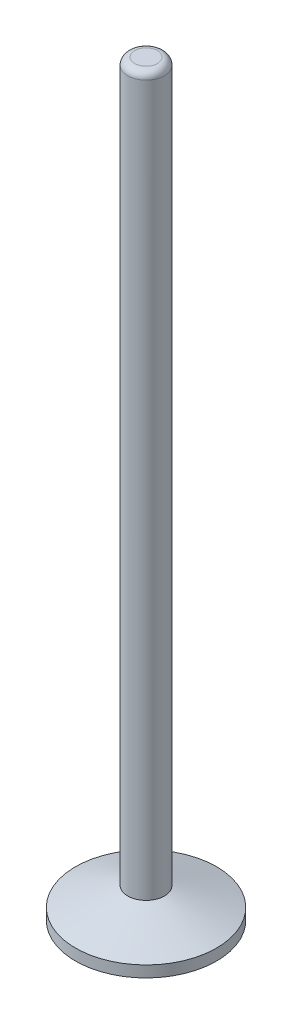
ISO-10303-21;
HEADER;
FILE_DESCRIPTION(('STEP AP214'),'2;1');
FILE_NAME('part.step','',(''),(''),'','','');
FILE_SCHEMA(('AUTOMOTIVE_DESIGN { 1 0 10303 214 1 1 1 1 }'));
ENDSEC;
DATA;
#1=APPLICATION_CONTEXT('core data for automotive mechanical design processes');
#2=APPLICATION_PROTOCOL_DEFINITION('international standard','automotive_design',2000,#1);
#3=PRODUCT_CONTEXT('',#1,'mechanical');
#4=PRODUCT('Part','Part','',(#3));
#5=PRODUCT_RELATED_PRODUCT_CATEGORY('part','',(#4));
#6=PRODUCT_DEFINITION_FORMATION('','',#4);
#7=PRODUCT_DEFINITION_CONTEXT('part definition',#1,'design');
#8=PRODUCT_DEFINITION('design','',#6,#7);
#9=PRODUCT_DEFINITION_SHAPE('','',#8);
#10=(LENGTH_UNIT() NAMED_UNIT(*) SI_UNIT(.MILLI.,.METRE.));
#11=(NAMED_UNIT(*) PLANE_ANGLE_UNIT() SI_UNIT($,.RADIAN.));
#12=(NAMED_UNIT(*) SI_UNIT($,.STERADIAN.) SOLID_ANGLE_UNIT());
#13=UNCERTAINTY_MEASURE_WITH_UNIT(LENGTH_MEASURE(1.E-05),#10,'distance_accuracy_value','');
#14=(GEOMETRIC_REPRESENTATION_CONTEXT(3) GLOBAL_UNCERTAINTY_ASSIGNED_CONTEXT((#13)) GLOBAL_UNIT_ASSIGNED_CONTEXT((#10,
#11,#12)) REPRESENTATION_CONTEXT('',''));
#15=CARTESIAN_POINT('',(0.,0.,0.));
#16=DIRECTION('',(0.,0.,1.));
#17=DIRECTION('',(1.,0.,0.));
#18=AXIS2_PLACEMENT_3D('',#15,#16,#17);
#19=CARTESIAN_POINT('',(50.,0.,0.));
#20=DIRECTION('',(0.,-1.,0.));
#21=DIRECTION('',(0.,0.,-1.));
#22=AXIS2_PLACEMENT_3D('',#19,#20,#21);
#23=PLANE('',#22);
#24=CARTESIAN_POINT('',(0.,0.,0.));
#25=DIRECTION('',(0.,-1.,0.));
#26=DIRECTION('',(0.,0.,-1.));
#27=AXIS2_PLACEMENT_3D('',#24,#25,#26);
#28=CIRCLE('',#27,50.);
#29=CARTESIAN_POINT('',(0.,0.,-50.));
#30=VERTEX_POINT('',#29);
#31=EDGE_CURVE('E53',#30,#30,#28,.T.);
#32=ORIENTED_EDGE('',*,*,#31,.T.);
#33=EDGE_LOOP('',(#32));
#34=FACE_BOUND('',#33,.T.);
#35=ADVANCED_FACE('F33',(#34),#23,.T.);
#36=CARTESIAN_POINT('',(0.,530.,0.));
#37=DIRECTION('',(0.,1.,0.));
#38=DIRECTION('',(0.,0.,1.));
#39=AXIS2_PLACEMENT_3D('',#36,#37,#38);
#40=PLANE('',#39);
#41=CARTESIAN_POINT('',(0.,530.,0.));
#42=DIRECTION('',(0.,1.,0.));
#43=DIRECTION('',(0.,0.,1.));
#44=AXIS2_PLACEMENT_3D('',#41,#42,#43);
#45=CIRCLE('',#44,8.00000000000003);
#46=CARTESIAN_POINT('',(0.,530.,8.00000000000003));
#47=VERTEX_POINT('',#46);
#48=EDGE_CURVE('E10',#47,#47,#45,.T.);
#49=ORIENTED_EDGE('',*,*,#48,.T.);
#50=EDGE_LOOP('',(#49));
#51=FACE_BOUND('',#50,.T.);
#52=ADVANCED_FACE('F72',(#51),#40,.T.);
#53=CARTESIAN_POINT('',(0.,0.,0.));
#54=DIRECTION('',(0.,-1.,0.));
#55=DIRECTION('',(0.,0.,-1.));
#56=AXIS2_PLACEMENT_3D('',#53,#54,#55);
#57=CYLINDRICAL_SURFACE('',#56,13.);
#58=CARTESIAN_POINT('',(0.,525.,0.));
#59=DIRECTION('',(0.,1.,0.));
#60=DIRECTION('',(0.,0.,1.));
#61=AXIS2_PLACEMENT_3D('',#58,#59,#60);
#62=CIRCLE('',#61,13.);
#63=CARTESIAN_POINT('',(0.,525.,13.));
#64=VERTEX_POINT('',#63);
#65=EDGE_CURVE('E40',#64,#64,#62,.F.);
#66=ORIENTED_EDGE('',*,*,#65,.T.);
#67=EDGE_LOOP('',(#66));
#68=FACE_BOUND('',#67,.T.);
#69=CARTESIAN_POINT('',(0.,21.4668986678492,0.));
#70=DIRECTION('',(0.,-1.,0.));
#71=DIRECTION('',(0.,0.,-1.));
#72=AXIS2_PLACEMENT_3D('',#69,#70,#71);
#73=CIRCLE('',#72,13.0000000000001);
#74=CARTESIAN_POINT('',(0.,21.4668986678492,-13.));
#75=VERTEX_POINT('',#74);
#76=EDGE_CURVE('E44',#75,#75,#73,.T.);
#77=ORIENTED_EDGE('',*,*,#76,.F.);
#78=EDGE_LOOP('',(#77));
#79=FACE_BOUND('',#78,.T.);
#80=ADVANCED_FACE('F68',(#68,#79),#57,.T.);
#81=CARTESIAN_POINT('',(0.,8.,0.));
#82=DIRECTION('',(0.,-1.,0.));
#83=DIRECTION('',(0.,0.,-1.));
#84=AXIS2_PLACEMENT_3D('',#81,#82,#83);
#85=CONICAL_SURFACE('',#84,50.,1.22173047639604);
#86=CARTESIAN_POINT('',(0.,8.,0.));
#87=DIRECTION('',(0.,-1.,0.));
#88=DIRECTION('',(0.,0.,-1.));
#89=AXIS2_PLACEMENT_3D('',#86,#87,#88);
#90=CIRCLE('',#89,50.);
#91=CARTESIAN_POINT('',(0.,8.,-50.));
#92=VERTEX_POINT('',#91);
#93=EDGE_CURVE('E48',#92,#92,#90,.T.);
#94=CARTESIAN_POINT('',(0.,21.4668986678492,-13.));
#95=CARTESIAN_POINT('',(0.,21.3266184733924,-13.3854166666667));
#96=CARTESIAN_POINT('',(0.,21.1863382789357,-13.7708333333334));
#97=CARTESIAN_POINT('',(0.,20.9057778900222,-14.5416666666667));
#98=CARTESIAN_POINT('',(0.,20.7654976955654,-14.9270833333334));
#99=CARTESIAN_POINT('',(0.,20.4849373066519,-15.6979166666667));
#100=CARTESIAN_POINT('',(0.,20.3446571121951,-16.0833333333334));
#101=CARTESIAN_POINT('',(0.,20.0640967232816,-16.8541666666667));
#102=CARTESIAN_POINT('',(0.,19.9238165288248,-17.2395833333334));
#103=CARTESIAN_POINT('',(0.,19.6432561399113,-18.0104166666667));
#104=CARTESIAN_POINT('',(0.,19.5029759454545,-18.3958333333334));
#105=CARTESIAN_POINT('',(0.,19.222415556541,-19.1666666666667));
#106=CARTESIAN_POINT('',(0.,19.0821353620842,-19.5520833333334));
#107=CARTESIAN_POINT('',(0.,18.8015749731707,-20.3229166666667));
#108=CARTESIAN_POINT('',(0.,18.6612947787139,-20.7083333333334));
#109=CARTESIAN_POINT('',(0.,18.3807343898004,-21.4791666666667));
#110=CARTESIAN_POINT('',(0.,18.2404541953437,-21.8645833333334));
#111=CARTESIAN_POINT('',(0.,17.9598938064301,-22.6354166666667));
#112=CARTESIAN_POINT('',(0.,17.8196136119734,-23.0208333333334));
#113=CARTESIAN_POINT('',(0.,17.5390532230599,-23.7916666666667));
#114=CARTESIAN_POINT('',(0.,17.3987730286031,-24.1770833333334));
#115=CARTESIAN_POINT('',(0.,17.1182126396896,-24.9479166666667));
#116=CARTESIAN_POINT('',(0.,16.9779324452328,-25.3333333333334));
#117=CARTESIAN_POINT('',(0.,16.6973720563193,-26.1041666666667));
#118=CARTESIAN_POINT('',(0.,16.5570918618625,-26.4895833333334));
#119=CARTESIAN_POINT('',(0.,16.276531472949,-27.2604166666667));
#120=CARTESIAN_POINT('',(0.,16.1362512784922,-27.6458333333334));
#121=CARTESIAN_POINT('',(0.,15.8556908895787,-28.4166666666667));
#122=CARTESIAN_POINT('',(0.,15.7154106951219,-28.8020833333334));
#123=CARTESIAN_POINT('',(0.,15.4348503062084,-29.5729166666667));
#124=CARTESIAN_POINT('',(0.,15.2945701117516,-29.9583333333334));
#125=CARTESIAN_POINT('',(0.,15.0140097228381,-30.7291666666667));
#126=CARTESIAN_POINT('',(0.,14.8737295283814,-31.1145833333334));
#127=CARTESIAN_POINT('',(0.,14.5931691394678,-31.8854166666667));
#128=CARTESIAN_POINT('',(0.,14.4528889450111,-32.2708333333333));
#129=CARTESIAN_POINT('',(0.,14.1723285560976,-33.0416666666667));
#130=CARTESIAN_POINT('',(0.,14.0320483616408,-33.4270833333333));
#131=CARTESIAN_POINT('',(0.,13.7514879727273,-34.1979166666667));
#132=CARTESIAN_POINT('',(0.,13.6112077782705,-34.5833333333334));
#133=CARTESIAN_POINT('',(0.,13.330647389357,-35.3541666666667));
#134=CARTESIAN_POINT('',(0.,13.1903671949002,-35.7395833333333));
#135=CARTESIAN_POINT('',(0.,12.9098068059867,-36.5104166666667));
#136=CARTESIAN_POINT('',(0.,12.7695266115299,-36.8958333333333));
#137=CARTESIAN_POINT('',(0.,12.4889662226164,-37.6666666666667));
#138=CARTESIAN_POINT('',(0.,12.3486860281596,-38.0520833333333));
#139=CARTESIAN_POINT('',(0.,12.0681256392461,-38.8229166666667));
#140=CARTESIAN_POINT('',(0.,11.9278454447894,-39.2083333333333));
#141=CARTESIAN_POINT('',(0.,11.6472850558758,-39.9791666666667));
#142=CARTESIAN_POINT('',(0.,11.5070048614191,-40.3645833333333));
#143=CARTESIAN_POINT('',(0.,11.2264444725055,-41.1354166666667));
#144=CARTESIAN_POINT('',(0.,11.0861642780488,-41.5208333333333));
#145=CARTESIAN_POINT('',(0.,10.8056038891353,-42.2916666666667));
#146=CARTESIAN_POINT('',(0.,10.6653236946785,-42.6770833333333));
#147=CARTESIAN_POINT('',(0.,10.384763305765,-43.4479166666667));
#148=CARTESIAN_POINT('',(0.,10.2444831113082,-43.8333333333333));
#149=CARTESIAN_POINT('',(0.,9.96392272239468,-44.6041666666667));
#150=CARTESIAN_POINT('',(0.,9.82364252793792,-44.9895833333333));
#151=CARTESIAN_POINT('',(0.,9.54308213902439,-45.7604166666667));
#152=CARTESIAN_POINT('',(0.,9.40280194456763,-46.1458333333333));
#153=CARTESIAN_POINT('',(0.,9.1222415556541,-46.9166666666667));
#154=CARTESIAN_POINT('',(0.,8.98196136119734,-47.3020833333333));
#155=CARTESIAN_POINT('',(0.,8.70140097228382,-48.0729166666667));
#156=CARTESIAN_POINT('',(0.,8.56112077782705,-48.4583333333333));
#157=CARTESIAN_POINT('',(0.,8.28056038891353,-49.2291666666667));
#158=CARTESIAN_POINT('',(0.,8.14028019445676,-49.6145833333333));
#159=CARTESIAN_POINT('',(0.,8.,-50.));
#160=B_SPLINE_CURVE_WITH_KNOTS('',3,(#94,#95,#96,#97,#98,#99,#100,#101,#102,#103,#104,#105,#106,
#107,#108,#109,#110,#111,#112,#113,#114,#115,#116,#117,#118,#119,#120,#121,#122,#123,#124,#125,
#126,#127,#128,#129,#130,#131,#132,#133,#134,#135,#136,#137,#138,#139,#140,#141,#142,#143,#144,
#145,#146,#147,#148,#149,#150,#151,#152,#153,#154,#155,#156,#157,#158,#159),.UNSPECIFIED.,.F.,
.F.,(4,2,2,2,2,2,2,2,2,2,2,2,2,2,2,2,2,2,2,2,2,2,2,2,2,2,2,2,2,2,2,2,4),(0.,1.23045554942527,
2.46091109885054,3.69136664827581,4.92182219770108,6.15227774712635,7.38273329655162,
8.61318884597688,9.84364439540216,11.0740999448274,12.3045554942527,13.535011043678,
14.7654665931032,15.9959221425285,17.2263776919538,18.456833241379,19.6872887908043,
20.9177443402296,22.1481998896548,23.3786554390801,24.6091109885054,25.8395665379307,
27.0700220873559,28.3004776367812,29.5309331862065,30.7613887356317,31.991844285057,
33.2222998344823,34.4527553839075,35.6832109333328,36.9136664827581,38.1441220321833,
39.3745775816086),.UNSPECIFIED.);
#161=EDGE_CURVE('BSEAM60',#75,#92,#160,.T.);
#162=ORIENTED_EDGE('',*,*,#76,.T.);
#163=ORIENTED_EDGE('',*,*,#93,.F.);
#164=ORIENTED_EDGE('',*,*,#161,.T.);
#165=ORIENTED_EDGE('',*,*,#161,.F.);
#166=EDGE_LOOP('',(#162,#164,#163,#165));
#167=FACE_BOUND('',#166,.T.);
#168=ADVANCED_FACE('F60',(#167),#85,.T.);
#169=CARTESIAN_POINT('',(0.,0.,0.));
#170=DIRECTION('',(0.,-1.,0.));
#171=DIRECTION('',(0.,0.,-1.));
#172=AXIS2_PLACEMENT_3D('',#169,#170,#171);
#173=CYLINDRICAL_SURFACE('',#172,50.);
#174=ORIENTED_EDGE('',*,*,#93,.T.);
#175=EDGE_LOOP('',(#174));
#176=FACE_BOUND('',#175,.T.);
#177=ORIENTED_EDGE('',*,*,#31,.F.);
#178=EDGE_LOOP('',(#177));
#179=FACE_BOUND('',#178,.T.);
#180=ADVANCED_FACE('F58',(#176,#179),#173,.T.);
#181=CARTESIAN_POINT('',(0.,525.,0.));
#182=DIRECTION('',(0.,1.,0.));
#183=DIRECTION('',(0.,0.,1.));
#184=AXIS2_PLACEMENT_3D('',#181,#182,#183);
#185=TOROIDAL_SURFACE('',#184,8.00000000000003,5.);
#186=ORIENTED_EDGE('',*,*,#48,.F.);
#187=EDGE_LOOP('',(#186));
#188=FACE_BOUND('',#187,.T.);
#189=ORIENTED_EDGE('',*,*,#65,.F.);
#190=EDGE_LOOP('',(#189));
#191=FACE_BOUND('',#190,.T.);
#192=ADVANCED_FACE('F35',(#188,#191),#185,.T.);
#193=CLOSED_SHELL('',(#35,#52,#80,#168,#180,#192));
#194=MANIFOLD_SOLID_BREP('B2',#193);
#195=ADVANCED_BREP_SHAPE_REPRESENTATION('',(#18,#194),#14);
#196=SHAPE_DEFINITION_REPRESENTATION(#9,#195);
ENDSEC;
END-ISO-10303-21;
